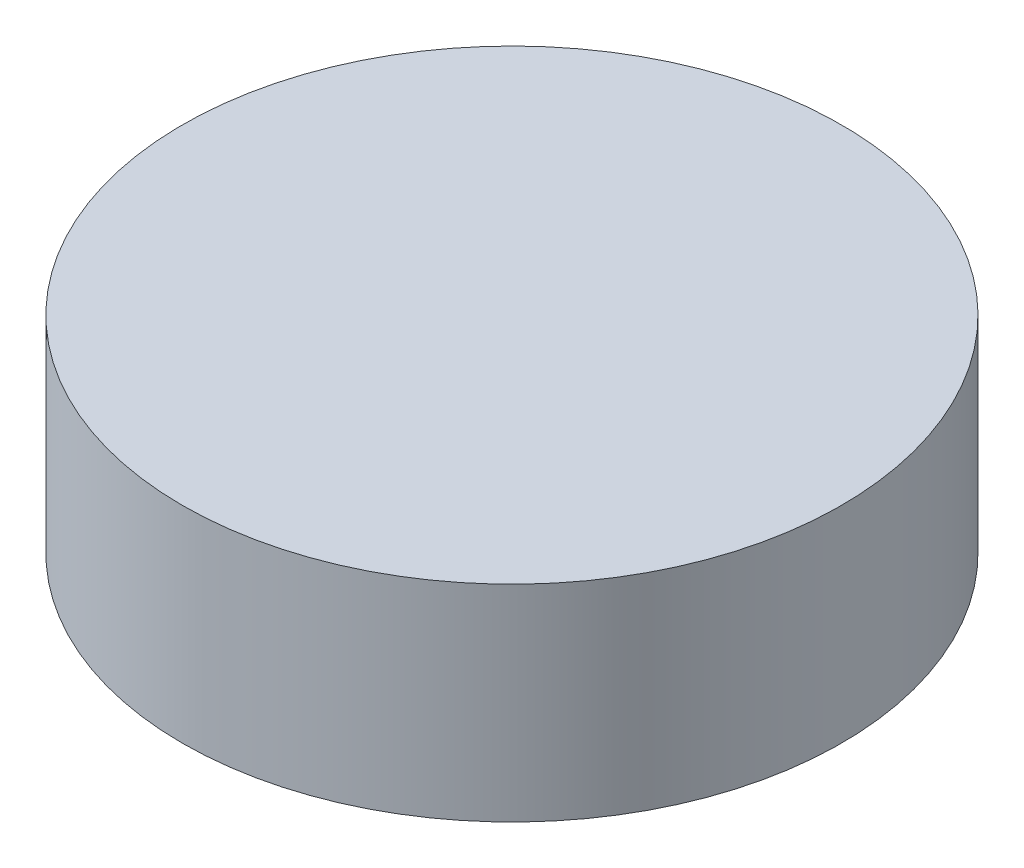
ISO-10303-21;
HEADER;
FILE_DESCRIPTION(('STEP AP214'),'2;1');
FILE_NAME('part.step','',(''),(''),'','','');
FILE_SCHEMA(('AUTOMOTIVE_DESIGN { 1 0 10303 214 1 1 1 1 }'));
ENDSEC;
DATA;
#1=APPLICATION_CONTEXT('core data for automotive mechanical design processes');
#2=APPLICATION_PROTOCOL_DEFINITION('international standard','automotive_design',2000,#1);
#3=PRODUCT_CONTEXT('',#1,'mechanical');
#4=PRODUCT('Part','Part','',(#3));
#5=PRODUCT_RELATED_PRODUCT_CATEGORY('part','',(#4));
#6=PRODUCT_DEFINITION_FORMATION('','',#4);
#7=PRODUCT_DEFINITION_CONTEXT('part definition',#1,'design');
#8=PRODUCT_DEFINITION('design','',#6,#7);
#9=PRODUCT_DEFINITION_SHAPE('','',#8);
#10=(LENGTH_UNIT() NAMED_UNIT(*) SI_UNIT(.MILLI.,.METRE.));
#11=(NAMED_UNIT(*) PLANE_ANGLE_UNIT() SI_UNIT($,.RADIAN.));
#12=(NAMED_UNIT(*) SI_UNIT($,.STERADIAN.) SOLID_ANGLE_UNIT());
#13=UNCERTAINTY_MEASURE_WITH_UNIT(LENGTH_MEASURE(1.E-05),#10,'distance_accuracy_value','');
#14=(GEOMETRIC_REPRESENTATION_CONTEXT(3) GLOBAL_UNCERTAINTY_ASSIGNED_CONTEXT((#13)) GLOBAL_UNIT_ASSIGNED_CONTEXT((#10,
#11,#12)) REPRESENTATION_CONTEXT('',''));
#15=CARTESIAN_POINT('',(0.,0.,0.));
#16=DIRECTION('',(0.,0.,1.));
#17=DIRECTION('',(1.,0.,0.));
#18=AXIS2_PLACEMENT_3D('',#15,#16,#17);
#19=CARTESIAN_POINT('',(0.,0.79375,0.));
#20=DIRECTION('',(0.,-1.,0.));
#21=DIRECTION('',(0.,0.,-1.));
#22=AXIS2_PLACEMENT_3D('',#19,#20,#21);
#23=CYLINDRICAL_SURFACE('',#22,2.54);
#24=CARTESIAN_POINT('',(0.,0.79375,0.));
#25=DIRECTION('',(0.,1.,0.));
#26=DIRECTION('',(0.,0.,1.));
#27=AXIS2_PLACEMENT_3D('',#24,#25,#26);
#28=CIRCLE('',#27,2.54);
#29=CARTESIAN_POINT('',(0.,0.79375,2.54));
#30=VERTEX_POINT('',#29);
#31=EDGE_CURVE('E10',#30,#30,#28,.T.);
#32=ORIENTED_EDGE('',*,*,#31,.F.);
#33=EDGE_LOOP('',(#32));
#34=FACE_BOUND('',#33,.T.);
#35=CARTESIAN_POINT('',(0.,-0.79375,0.));
#36=DIRECTION('',(0.,1.,0.));
#37=DIRECTION('',(0.,0.,1.));
#38=AXIS2_PLACEMENT_3D('',#35,#36,#37);
#39=CIRCLE('',#38,2.54);
#40=CARTESIAN_POINT('',(0.,-0.79375,2.54));
#41=VERTEX_POINT('',#40);
#42=EDGE_CURVE('E34',#41,#41,#39,.T.);
#43=ORIENTED_EDGE('',*,*,#42,.T.);
#44=EDGE_LOOP('',(#43));
#45=FACE_BOUND('',#44,.T.);
#46=ADVANCED_FACE('F31',(#34,#45),#23,.T.);
#47=CARTESIAN_POINT('',(0.,0.79375,0.));
#48=DIRECTION('',(0.,1.,0.));
#49=DIRECTION('',(0.,0.,1.));
#50=AXIS2_PLACEMENT_3D('',#47,#48,#49);
#51=PLANE('',#50);
#52=ORIENTED_EDGE('',*,*,#31,.T.);
#53=EDGE_LOOP('',(#52));
#54=FACE_BOUND('',#53,.T.);
#55=ADVANCED_FACE('F46',(#54),#51,.T.);
#56=CARTESIAN_POINT('',(0.,-0.79375,0.));
#57=DIRECTION('',(0.,1.,0.));
#58=DIRECTION('',(0.,0.,1.));
#59=AXIS2_PLACEMENT_3D('',#56,#57,#58);
#60=PLANE('',#59);
#61=ORIENTED_EDGE('',*,*,#42,.F.);
#62=EDGE_LOOP('',(#61));
#63=FACE_BOUND('',#62,.T.);
#64=ADVANCED_FACE('F44',(#63),#60,.F.);
#65=CLOSED_SHELL('',(#46,#55,#64));
#66=MANIFOLD_SOLID_BREP('B2',#65);
#67=ADVANCED_BREP_SHAPE_REPRESENTATION('',(#18,#66),#14);
#68=SHAPE_DEFINITION_REPRESENTATION(#9,#67);
ENDSEC;
END-ISO-10303-21;
